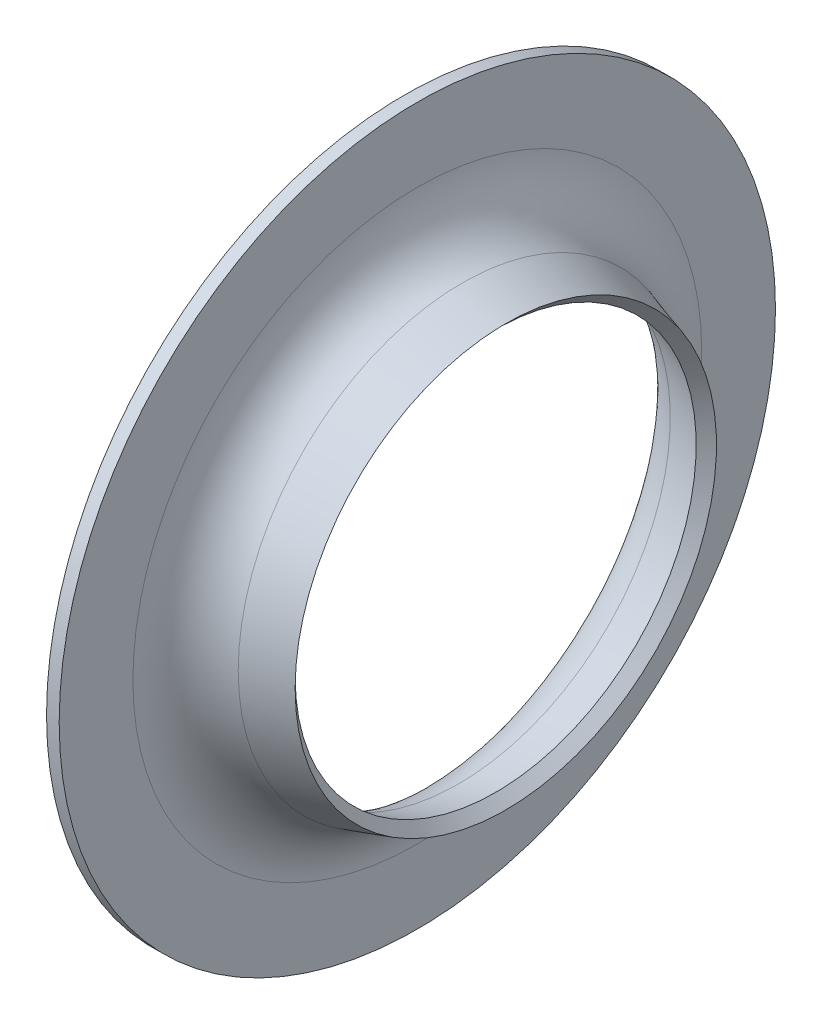
ISO-10303-21;
HEADER;
FILE_DESCRIPTION(('STEP AP214'),'2;1');
FILE_NAME('part.step','',(''),(''),'','','');
FILE_SCHEMA(('AUTOMOTIVE_DESIGN { 1 0 10303 214 1 1 1 1 }'));
ENDSEC;
DATA;
#1=APPLICATION_CONTEXT('core data for automotive mechanical design processes');
#2=APPLICATION_PROTOCOL_DEFINITION('international standard','automotive_design',2000,#1);
#3=PRODUCT_CONTEXT('',#1,'mechanical');
#4=PRODUCT('Part','Part','',(#3));
#5=PRODUCT_RELATED_PRODUCT_CATEGORY('part','',(#4));
#6=PRODUCT_DEFINITION_FORMATION('','',#4);
#7=PRODUCT_DEFINITION_CONTEXT('part definition',#1,'design');
#8=PRODUCT_DEFINITION('design','',#6,#7);
#9=PRODUCT_DEFINITION_SHAPE('','',#8);
#10=(LENGTH_UNIT() NAMED_UNIT(*) SI_UNIT(.MILLI.,.METRE.));
#11=(NAMED_UNIT(*) PLANE_ANGLE_UNIT() SI_UNIT($,.RADIAN.));
#12=(NAMED_UNIT(*) SI_UNIT($,.STERADIAN.) SOLID_ANGLE_UNIT());
#13=UNCERTAINTY_MEASURE_WITH_UNIT(LENGTH_MEASURE(1.E-05),#10,'distance_accuracy_value','');
#14=(GEOMETRIC_REPRESENTATION_CONTEXT(3) GLOBAL_UNCERTAINTY_ASSIGNED_CONTEXT((#13)) GLOBAL_UNIT_ASSIGNED_CONTEXT((#10,
#11,#12)) REPRESENTATION_CONTEXT('',''));
#15=CARTESIAN_POINT('',(0.,0.,0.));
#16=DIRECTION('',(0.,0.,1.));
#17=DIRECTION('',(1.,0.,0.));
#18=AXIS2_PLACEMENT_3D('',#15,#16,#17);
#19=CARTESIAN_POINT('',(-48.7455963614191,0.,0.));
#20=DIRECTION('',(-1.,0.,0.));
#21=DIRECTION('',(0.,0.,1.));
#22=AXIS2_PLACEMENT_3D('',#19,#20,#21);
#23=CYLINDRICAL_SURFACE('',#22,17.);
#24=CARTESIAN_POINT('',(-4.8,0.,0.));
#25=DIRECTION('',(-1.,0.,0.));
#26=DIRECTION('',(0.,0.,1.));
#27=AXIS2_PLACEMENT_3D('',#24,#25,#26);
#28=CIRCLE('',#27,17.);
#29=CARTESIAN_POINT('',(-4.8,0.,17.));
#30=VERTEX_POINT('',#29);
#31=EDGE_CURVE('E63',#30,#30,#28,.T.);
#32=ORIENTED_EDGE('',*,*,#31,.F.);
#33=EDGE_LOOP('',(#32));
#34=FACE_BOUND('',#33,.T.);
#35=CARTESIAN_POINT('',(-4.2,0.,0.));
#36=DIRECTION('',(-1.,0.,0.));
#37=DIRECTION('',(0.,0.,1.));
#38=AXIS2_PLACEMENT_3D('',#35,#36,#37);
#39=CIRCLE('',#38,17.);
#40=CARTESIAN_POINT('',(-4.2,0.,17.));
#41=VERTEX_POINT('',#40);
#42=EDGE_CURVE('E10',#41,#41,#39,.T.);
#43=ORIENTED_EDGE('',*,*,#42,.T.);
#44=EDGE_LOOP('',(#43));
#45=FACE_BOUND('',#44,.T.);
#46=ADVANCED_FACE('F35',(#34,#45),#23,.T.);
#47=CARTESIAN_POINT('',(-4.2,17.,0.));
#48=DIRECTION('',(-1.,0.,0.));
#49=DIRECTION('',(0.,0.,1.));
#50=AXIS2_PLACEMENT_3D('',#47,#48,#49);
#51=PLANE('',#50);
#52=ORIENTED_EDGE('',*,*,#42,.F.);
#53=EDGE_LOOP('',(#52));
#54=FACE_BOUND('',#53,.T.);
#55=CARTESIAN_POINT('',(-4.2,0.,0.));
#56=DIRECTION('',(-1.,0.,0.));
#57=DIRECTION('',(0.,0.,1.));
#58=AXIS2_PLACEMENT_3D('',#55,#56,#57);
#59=CIRCLE('',#58,13.5);
#60=CARTESIAN_POINT('',(-4.2,0.,13.5));
#61=VERTEX_POINT('',#60);
#62=EDGE_CURVE('E41',#61,#61,#59,.T.);
#63=ORIENTED_EDGE('',*,*,#62,.T.);
#64=EDGE_LOOP('',(#63));
#65=FACE_BOUND('',#64,.T.);
#66=ADVANCED_FACE('F70',(#54,#65),#51,.F.);
#67=CARTESIAN_POINT('',(-1.2,0.,0.));
#68=DIRECTION('',(-1.,0.,0.));
#69=DIRECTION('',(0.,0.,1.));
#70=AXIS2_PLACEMENT_3D('',#67,#68,#69);
#71=TOROIDAL_SURFACE('',#70,13.5,3.);
#72=ORIENTED_EDGE('',*,*,#62,.F.);
#73=EDGE_LOOP('',(#72));
#74=FACE_BOUND('',#73,.T.);
#75=CARTESIAN_POINT('',(-2.07211309124127,0.,0.));
#76=DIRECTION('',(-1.,0.,0.));
#77=DIRECTION('',(0.,0.,1.));
#78=AXIS2_PLACEMENT_3D('',#75,#76,#77);
#79=CIRCLE('',#78,10.6295612258601);
#80=CARTESIAN_POINT('',(-2.07211309124127,0.,10.6295612258601));
#81=VERTEX_POINT('',#80);
#82=EDGE_CURVE('E45',#81,#81,#79,.T.);
#83=ORIENTED_EDGE('',*,*,#82,.T.);
#84=EDGE_LOOP('',(#83));
#85=FACE_BOUND('',#84,.T.);
#86=ADVANCED_FACE('F74',(#74,#85),#71,.F.);
#87=CARTESIAN_POINT('',(0.,0.,0.));
#88=DIRECTION('',(-1.,0.,0.));
#89=DIRECTION('',(0.,0.,1.));
#90=AXIS2_PLACEMENT_3D('',#87,#88,#89);
#91=CONICAL_SURFACE('',#90,10.,0.294962911687772);
#92=ORIENTED_EDGE('',*,*,#82,.F.);
#93=EDGE_LOOP('',(#92));
#94=FACE_BOUND('',#93,.T.);
#95=CARTESIAN_POINT('',(0.,0.,0.));
#96=DIRECTION('',(-1.,0.,0.));
#97=DIRECTION('',(0.,0.,1.));
#98=AXIS2_PLACEMENT_3D('',#95,#96,#97);
#99=CIRCLE('',#98,10.);
#100=CARTESIAN_POINT('',(0.,0.,10.));
#101=VERTEX_POINT('',#100);
#102=EDGE_CURVE('E49',#101,#101,#99,.T.);
#103=ORIENTED_EDGE('',*,*,#102,.T.);
#104=EDGE_LOOP('',(#103));
#105=FACE_BOUND('',#104,.T.);
#106=ADVANCED_FACE('F79',(#94,#105),#91,.T.);
#107=CARTESIAN_POINT('',(-0.480955258536329,0.,0.));
#108=DIRECTION('',(1.,0.,0.));
#109=DIRECTION('',(0.,0.,-1.));
#110=AXIS2_PLACEMENT_3D('',#107,#108,#109);
#111=CONICAL_SURFACE('',#110,9.51904474146367,0.785398163397445);
#112=ORIENTED_EDGE('',*,*,#102,.F.);
#113=EDGE_LOOP('',(#112));
#114=FACE_BOUND('',#113,.T.);
#115=CARTESIAN_POINT('',(-0.480955258536329,0.,0.));
#116=DIRECTION('',(-1.,0.,0.));
#117=DIRECTION('',(0.,0.,1.));
#118=AXIS2_PLACEMENT_3D('',#115,#116,#117);
#119=CIRCLE('',#118,9.51904474146367);
#120=CARTESIAN_POINT('',(-0.480955258536329,0.,9.51904474146367));
#121=VERTEX_POINT('',#120);
#122=EDGE_CURVE('E54',#121,#121,#119,.T.);
#123=ORIENTED_EDGE('',*,*,#122,.T.);
#124=EDGE_LOOP('',(#123));
#125=FACE_BOUND('',#124,.T.);
#126=ADVANCED_FACE('F85',(#114,#125),#111,.F.);
#127=CARTESIAN_POINT('',(-2.24653570948953,0.,0.));
#128=DIRECTION('',(-1.,0.,0.));
#129=DIRECTION('',(0.,0.,1.));
#130=AXIS2_PLACEMENT_3D('',#127,#128,#129);
#131=CONICAL_SURFACE('',#130,10.0554734710322,0.294962911687772);
#132=ORIENTED_EDGE('',*,*,#122,.F.);
#133=EDGE_LOOP('',(#132));
#134=FACE_BOUND('',#133,.T.);
#135=CARTESIAN_POINT('',(-2.24653570948953,0.,0.));
#136=DIRECTION('',(-1.,0.,0.));
#137=DIRECTION('',(0.,0.,1.));
#138=AXIS2_PLACEMENT_3D('',#135,#136,#137);
#139=CIRCLE('',#138,10.0554734710322);
#140=CARTESIAN_POINT('',(-2.24653570948953,0.,10.0554734710322));
#141=VERTEX_POINT('',#140);
#142=EDGE_CURVE('E57',#141,#141,#139,.T.);
#143=ORIENTED_EDGE('',*,*,#142,.T.);
#144=EDGE_LOOP('',(#143));
#145=FACE_BOUND('',#144,.T.);
#146=ADVANCED_FACE('F89',(#134,#145),#131,.F.);
#147=CARTESIAN_POINT('',(-1.2,0.,0.));
#148=DIRECTION('',(-1.,0.,0.));
#149=DIRECTION('',(0.,0.,1.));
#150=AXIS2_PLACEMENT_3D('',#147,#148,#149);
#151=TOROIDAL_SURFACE('',#150,13.5,3.6);
#152=ORIENTED_EDGE('',*,*,#142,.F.);
#153=EDGE_LOOP('',(#152));
#154=FACE_BOUND('',#153,.T.);
#155=CARTESIAN_POINT('',(-4.8,0.,0.));
#156=DIRECTION('',(-1.,0.,0.));
#157=DIRECTION('',(0.,0.,1.));
#158=AXIS2_PLACEMENT_3D('',#155,#156,#157);
#159=CIRCLE('',#158,13.5);
#160=CARTESIAN_POINT('',(-4.8,0.,13.5));
#161=VERTEX_POINT('',#160);
#162=EDGE_CURVE('E60',#161,#161,#159,.T.);
#163=ORIENTED_EDGE('',*,*,#162,.T.);
#164=EDGE_LOOP('',(#163));
#165=FACE_BOUND('',#164,.T.);
#166=ADVANCED_FACE('F93',(#154,#165),#151,.T.);
#167=CARTESIAN_POINT('',(-4.8,17.,0.));
#168=DIRECTION('',(1.,0.,0.));
#169=DIRECTION('',(0.,0.,-1.));
#170=AXIS2_PLACEMENT_3D('',#167,#168,#169);
#171=PLANE('',#170);
#172=ORIENTED_EDGE('',*,*,#162,.F.);
#173=EDGE_LOOP('',(#172));
#174=FACE_BOUND('',#173,.T.);
#175=ORIENTED_EDGE('',*,*,#31,.T.);
#176=EDGE_LOOP('',(#175));
#177=FACE_BOUND('',#176,.T.);
#178=ADVANCED_FACE('F67',(#174,#177),#171,.F.);
#179=CLOSED_SHELL('',(#46,#66,#86,#106,#126,#146,#166,#178));
#180=MANIFOLD_SOLID_BREP('B2',#179);
#181=ADVANCED_BREP_SHAPE_REPRESENTATION('',(#18,#180),#14);
#182=SHAPE_DEFINITION_REPRESENTATION(#9,#181);
ENDSEC;
END-ISO-10303-21;
